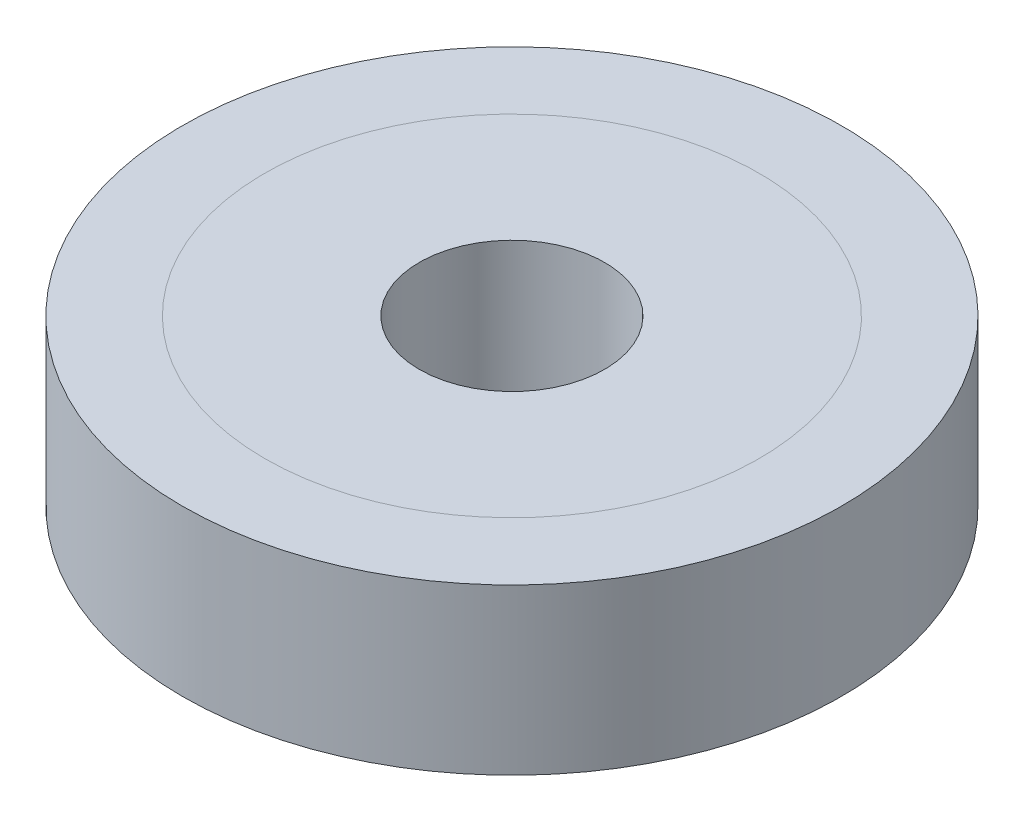
ISO-10303-21;
HEADER;
FILE_DESCRIPTION(('STEP AP214'),'2;1');
FILE_NAME('part.step','',(''),(''),'','','');
FILE_SCHEMA(('AUTOMOTIVE_DESIGN { 1 0 10303 214 1 1 1 1 }'));
ENDSEC;
DATA;
#1=APPLICATION_CONTEXT('core data for automotive mechanical design processes');
#2=APPLICATION_PROTOCOL_DEFINITION('international standard','automotive_design',2000,#1);
#3=PRODUCT_CONTEXT('',#1,'mechanical');
#4=PRODUCT('Part','Part','',(#3));
#5=PRODUCT_RELATED_PRODUCT_CATEGORY('part','',(#4));
#6=PRODUCT_DEFINITION_FORMATION('','',#4);
#7=PRODUCT_DEFINITION_CONTEXT('part definition',#1,'design');
#8=PRODUCT_DEFINITION('design','',#6,#7);
#9=PRODUCT_DEFINITION_SHAPE('','',#8);
#10=(LENGTH_UNIT() NAMED_UNIT(*) SI_UNIT(.MILLI.,.METRE.));
#11=(NAMED_UNIT(*) PLANE_ANGLE_UNIT() SI_UNIT($,.RADIAN.));
#12=(NAMED_UNIT(*) SI_UNIT($,.STERADIAN.) SOLID_ANGLE_UNIT());
#13=UNCERTAINTY_MEASURE_WITH_UNIT(LENGTH_MEASURE(1.E-05),#10,'distance_accuracy_value','');
#14=(GEOMETRIC_REPRESENTATION_CONTEXT(3) GLOBAL_UNCERTAINTY_ASSIGNED_CONTEXT((#13)) GLOBAL_UNIT_ASSIGNED_CONTEXT((#10,
#11,#12)) REPRESENTATION_CONTEXT('',''));
#15=CARTESIAN_POINT('',(0.,0.,0.));
#16=DIRECTION('',(0.,0.,1.));
#17=DIRECTION('',(1.,0.,0.));
#18=AXIS2_PLACEMENT_3D('',#15,#16,#17);
#19=CARTESIAN_POINT('',(0.,-45.254833995939,0.));
#20=DIRECTION('',(0.,1.,0.));
#21=DIRECTION('',(0.,0.,1.));
#22=AXIS2_PLACEMENT_3D('',#19,#20,#21);
#23=CYLINDRICAL_SURFACE('',#22,16.);
#24=CARTESIAN_POINT('',(0.,0.,0.));
#25=DIRECTION('',(0.,1.,0.));
#26=DIRECTION('',(0.,0.,1.));
#27=AXIS2_PLACEMENT_3D('',#24,#25,#26);
#28=CIRCLE('',#27,16.);
#29=CARTESIAN_POINT('',(0.,0.,16.));
#30=VERTEX_POINT('',#29);
#31=EDGE_CURVE('E11',#30,#30,#28,.F.);
#32=CARTESIAN_POINT('',(0.,8.,0.));
#33=DIRECTION('',(0.,1.,0.));
#34=DIRECTION('',(0.,0.,1.));
#35=AXIS2_PLACEMENT_3D('',#32,#33,#34);
#36=CIRCLE('',#35,16.);
#37=CARTESIAN_POINT('',(0.,7.99999999999999,16.));
#38=VERTEX_POINT('',#37);
#39=EDGE_CURVE('E58',#38,#38,#36,.T.);
#40=CARTESIAN_POINT('',(0.,0.,16.));
#41=CARTESIAN_POINT('',(0.,0.0833333333333333,16.));
#42=CARTESIAN_POINT('',(0.,0.166666666666667,16.));
#43=CARTESIAN_POINT('',(0.,0.333333333333334,16.));
#44=CARTESIAN_POINT('',(0.,0.416666666666667,16.));
#45=CARTESIAN_POINT('',(0.,0.583333333333334,16.));
#46=CARTESIAN_POINT('',(0.,0.666666666666667,16.));
#47=CARTESIAN_POINT('',(0.,0.833333333333334,16.));
#48=CARTESIAN_POINT('',(0.,0.916666666666668,16.));
#49=CARTESIAN_POINT('',(0.,1.08333333333333,16.));
#50=CARTESIAN_POINT('',(0.,1.16666666666667,16.));
#51=CARTESIAN_POINT('',(0.,1.33333333333333,16.));
#52=CARTESIAN_POINT('',(0.,1.41666666666667,16.));
#53=CARTESIAN_POINT('',(0.,1.58333333333333,16.));
#54=CARTESIAN_POINT('',(0.,1.66666666666667,16.));
#55=CARTESIAN_POINT('',(0.,1.83333333333334,16.));
#56=CARTESIAN_POINT('',(0.,1.91666666666667,16.));
#57=CARTESIAN_POINT('',(0.,2.08333333333333,16.));
#58=CARTESIAN_POINT('',(0.,2.16666666666666,16.));
#59=CARTESIAN_POINT('',(0.,2.33333333333333,16.));
#60=CARTESIAN_POINT('',(0.,2.41666666666666,16.));
#61=CARTESIAN_POINT('',(0.,2.58333333333333,16.));
#62=CARTESIAN_POINT('',(0.,2.66666666666666,16.));
#63=CARTESIAN_POINT('',(0.,2.83333333333333,16.));
#64=CARTESIAN_POINT('',(0.,2.91666666666666,16.));
#65=CARTESIAN_POINT('',(0.,3.08333333333333,16.));
#66=CARTESIAN_POINT('',(0.,3.16666666666666,16.));
#67=CARTESIAN_POINT('',(0.,3.33333333333333,16.));
#68=CARTESIAN_POINT('',(0.,3.41666666666666,16.));
#69=CARTESIAN_POINT('',(0.,3.58333333333333,16.));
#70=CARTESIAN_POINT('',(0.,3.66666666666666,16.));
#71=CARTESIAN_POINT('',(0.,3.83333333333333,16.));
#72=CARTESIAN_POINT('',(0.,3.91666666666666,16.));
#73=CARTESIAN_POINT('',(0.,4.08333333333333,16.));
#74=CARTESIAN_POINT('',(0.,4.16666666666666,16.));
#75=CARTESIAN_POINT('',(0.,4.33333333333333,16.));
#76=CARTESIAN_POINT('',(0.,4.41666666666666,16.));
#77=CARTESIAN_POINT('',(0.,4.58333333333333,16.));
#78=CARTESIAN_POINT('',(0.,4.66666666666666,16.));
#79=CARTESIAN_POINT('',(0.,4.83333333333333,16.));
#80=CARTESIAN_POINT('',(0.,4.91666666666666,16.));
#81=CARTESIAN_POINT('',(0.,5.08333333333333,16.));
#82=CARTESIAN_POINT('',(0.,5.16666666666666,16.));
#83=CARTESIAN_POINT('',(0.,5.33333333333333,16.));
#84=CARTESIAN_POINT('',(0.,5.41666666666666,16.));
#85=CARTESIAN_POINT('',(0.,5.58333333333333,16.));
#86=CARTESIAN_POINT('',(0.,5.66666666666666,16.));
#87=CARTESIAN_POINT('',(0.,5.83333333333333,16.));
#88=CARTESIAN_POINT('',(0.,5.91666666666666,16.));
#89=CARTESIAN_POINT('',(0.,6.08333333333333,16.));
#90=CARTESIAN_POINT('',(0.,6.16666666666666,16.));
#91=CARTESIAN_POINT('',(0.,6.33333333333333,16.));
#92=CARTESIAN_POINT('',(0.,6.41666666666666,16.));
#93=CARTESIAN_POINT('',(0.,6.58333333333333,16.));
#94=CARTESIAN_POINT('',(0.,6.66666666666666,16.));
#95=CARTESIAN_POINT('',(0.,6.83333333333333,16.));
#96=CARTESIAN_POINT('',(0.,6.91666666666666,16.));
#97=CARTESIAN_POINT('',(0.,7.08333333333333,16.));
#98=CARTESIAN_POINT('',(0.,7.16666666666666,16.));
#99=CARTESIAN_POINT('',(0.,7.33333333333333,16.));
#100=CARTESIAN_POINT('',(0.,7.41666666666666,16.));
#101=CARTESIAN_POINT('',(0.,7.58333333333333,16.));
#102=CARTESIAN_POINT('',(0.,7.66666666666666,16.));
#103=CARTESIAN_POINT('',(0.,7.83333333333333,16.));
#104=CARTESIAN_POINT('',(0.,7.91666666666666,16.));
#105=CARTESIAN_POINT('',(0.,7.99999999999999,16.));
#106=B_SPLINE_CURVE_WITH_KNOTS('',3,(#40,#41,#42,#43,#44,#45,#46,#47,#48,#49,#50,#51,#52,#53,
#54,#55,#56,#57,#58,#59,#60,#61,#62,#63,#64,#65,#66,#67,#68,#69,#70,#71,#72,#73,#74,#75,#76,#77,
#78,#79,#80,#81,#82,#83,#84,#85,#86,#87,#88,#89,#90,#91,#92,#93,#94,#95,#96,#97,#98,#99,#100,
#101,#102,#103,#104,#105),.UNSPECIFIED.,.F.,.F.,(4,2,2,2,2,2,2,2,2,2,2,2,2,2,2,2,2,2,2,2,2,2,2,
2,2,2,2,2,2,2,2,2,4),(0.,0.25,0.5,0.750000000000001,1.,1.25,1.5,1.75,2.,2.25,2.5,2.75,3.,3.25,
3.5,3.75,4.,4.25,4.5,4.75,5.,5.25,5.5,5.74999999999999,5.99999999999999,6.24999999999999,
6.49999999999999,6.74999999999999,6.99999999999999,7.24999999999999,7.49999999999999,
7.74999999999999,7.99999999999999),.UNSPECIFIED.);
#107=EDGE_CURVE('BSEAM47',#30,#38,#106,.T.);
#108=ORIENTED_EDGE('',*,*,#31,.F.);
#109=ORIENTED_EDGE('',*,*,#39,.F.);
#110=ORIENTED_EDGE('',*,*,#107,.T.);
#111=ORIENTED_EDGE('',*,*,#107,.F.);
#112=EDGE_LOOP('',(#108,#110,#109,#111));
#113=FACE_BOUND('',#112,.T.);
#114=ADVANCED_FACE('F47',(#113),#23,.T.);
#115=CARTESIAN_POINT('',(0.,8.,0.));
#116=DIRECTION('',(0.,1.,0.));
#117=DIRECTION('',(0.,0.,1.));
#118=AXIS2_PLACEMENT_3D('',#115,#116,#117);
#119=PLANE('',#118);
#120=CARTESIAN_POINT('',(0.,8.,0.));
#121=DIRECTION('',(0.,1.,0.));
#122=DIRECTION('',(0.,0.,1.));
#123=AXIS2_PLACEMENT_3D('',#120,#121,#122);
#124=CIRCLE('',#123,12.);
#125=CARTESIAN_POINT('',(0.,7.99999999999999,12.));
#126=VERTEX_POINT('',#125);
#127=EDGE_CURVE('E60',#126,#126,#124,.T.);
#128=ORIENTED_EDGE('',*,*,#127,.F.);
#129=EDGE_LOOP('',(#128));
#130=FACE_BOUND('',#129,.T.);
#131=ORIENTED_EDGE('',*,*,#39,.T.);
#132=EDGE_LOOP('',(#131));
#133=FACE_BOUND('',#132,.T.);
#134=ADVANCED_FACE('F65',(#130,#133),#119,.T.);
#135=CARTESIAN_POINT('',(0.,-45.254833995939,0.));
#136=DIRECTION('',(0.,1.,0.));
#137=DIRECTION('',(0.,0.,1.));
#138=AXIS2_PLACEMENT_3D('',#135,#136,#137);
#139=CYLINDRICAL_SURFACE('',#138,12.);
#140=CARTESIAN_POINT('',(0.,0.,0.));
#141=DIRECTION('',(0.,1.,0.));
#142=DIRECTION('',(0.,0.,1.));
#143=AXIS2_PLACEMENT_3D('',#140,#141,#142);
#144=CIRCLE('',#143,12.);
#145=CARTESIAN_POINT('',(0.,0.,12.));
#146=VERTEX_POINT('',#145);
#147=EDGE_CURVE('E50',#146,#146,#144,.F.);
#148=CARTESIAN_POINT('',(0.,0.,12.));
#149=CARTESIAN_POINT('',(0.,0.0833333333333333,12.));
#150=CARTESIAN_POINT('',(0.,0.166666666666667,12.));
#151=CARTESIAN_POINT('',(0.,0.333333333333334,12.));
#152=CARTESIAN_POINT('',(0.,0.416666666666667,12.));
#153=CARTESIAN_POINT('',(0.,0.583333333333334,12.));
#154=CARTESIAN_POINT('',(0.,0.666666666666667,12.));
#155=CARTESIAN_POINT('',(0.,0.833333333333334,12.));
#156=CARTESIAN_POINT('',(0.,0.916666666666668,12.));
#157=CARTESIAN_POINT('',(0.,1.08333333333333,12.));
#158=CARTESIAN_POINT('',(0.,1.16666666666667,12.));
#159=CARTESIAN_POINT('',(0.,1.33333333333333,12.));
#160=CARTESIAN_POINT('',(0.,1.41666666666667,12.));
#161=CARTESIAN_POINT('',(0.,1.58333333333333,12.));
#162=CARTESIAN_POINT('',(0.,1.66666666666667,12.));
#163=CARTESIAN_POINT('',(0.,1.83333333333334,12.));
#164=CARTESIAN_POINT('',(0.,1.91666666666667,12.));
#165=CARTESIAN_POINT('',(0.,2.08333333333333,12.));
#166=CARTESIAN_POINT('',(0.,2.16666666666666,12.));
#167=CARTESIAN_POINT('',(0.,2.33333333333333,12.));
#168=CARTESIAN_POINT('',(0.,2.41666666666666,12.));
#169=CARTESIAN_POINT('',(0.,2.58333333333333,12.));
#170=CARTESIAN_POINT('',(0.,2.66666666666666,12.));
#171=CARTESIAN_POINT('',(0.,2.83333333333333,12.));
#172=CARTESIAN_POINT('',(0.,2.91666666666666,12.));
#173=CARTESIAN_POINT('',(0.,3.08333333333333,12.));
#174=CARTESIAN_POINT('',(0.,3.16666666666666,12.));
#175=CARTESIAN_POINT('',(0.,3.33333333333333,12.));
#176=CARTESIAN_POINT('',(0.,3.41666666666666,12.));
#177=CARTESIAN_POINT('',(0.,3.58333333333333,12.));
#178=CARTESIAN_POINT('',(0.,3.66666666666666,12.));
#179=CARTESIAN_POINT('',(0.,3.83333333333333,12.));
#180=CARTESIAN_POINT('',(0.,3.91666666666666,12.));
#181=CARTESIAN_POINT('',(0.,4.08333333333333,12.));
#182=CARTESIAN_POINT('',(0.,4.16666666666666,12.));
#183=CARTESIAN_POINT('',(0.,4.33333333333333,12.));
#184=CARTESIAN_POINT('',(0.,4.41666666666666,12.));
#185=CARTESIAN_POINT('',(0.,4.58333333333333,12.));
#186=CARTESIAN_POINT('',(0.,4.66666666666666,12.));
#187=CARTESIAN_POINT('',(0.,4.83333333333333,12.));
#188=CARTESIAN_POINT('',(0.,4.91666666666666,12.));
#189=CARTESIAN_POINT('',(0.,5.08333333333333,12.));
#190=CARTESIAN_POINT('',(0.,5.16666666666666,12.));
#191=CARTESIAN_POINT('',(0.,5.33333333333333,12.));
#192=CARTESIAN_POINT('',(0.,5.41666666666666,12.));
#193=CARTESIAN_POINT('',(0.,5.58333333333333,12.));
#194=CARTESIAN_POINT('',(0.,5.66666666666666,12.));
#195=CARTESIAN_POINT('',(0.,5.83333333333333,12.));
#196=CARTESIAN_POINT('',(0.,5.91666666666666,12.));
#197=CARTESIAN_POINT('',(0.,6.08333333333333,12.));
#198=CARTESIAN_POINT('',(0.,6.16666666666666,12.));
#199=CARTESIAN_POINT('',(0.,6.33333333333333,12.));
#200=CARTESIAN_POINT('',(0.,6.41666666666666,12.));
#201=CARTESIAN_POINT('',(0.,6.58333333333333,12.));
#202=CARTESIAN_POINT('',(0.,6.66666666666666,12.));
#203=CARTESIAN_POINT('',(0.,6.83333333333333,12.));
#204=CARTESIAN_POINT('',(0.,6.91666666666666,12.));
#205=CARTESIAN_POINT('',(0.,7.08333333333333,12.));
#206=CARTESIAN_POINT('',(0.,7.16666666666666,12.));
#207=CARTESIAN_POINT('',(0.,7.33333333333333,12.));
#208=CARTESIAN_POINT('',(0.,7.41666666666666,12.));
#209=CARTESIAN_POINT('',(0.,7.58333333333333,12.));
#210=CARTESIAN_POINT('',(0.,7.66666666666666,12.));
#211=CARTESIAN_POINT('',(0.,7.83333333333333,12.));
#212=CARTESIAN_POINT('',(0.,7.91666666666666,12.));
#213=CARTESIAN_POINT('',(0.,7.99999999999999,12.));
#214=B_SPLINE_CURVE_WITH_KNOTS('',3,(#148,#149,#150,#151,#152,#153,#154,#155,#156,#157,#158,
#159,#160,#161,#162,#163,#164,#165,#166,#167,#168,#169,#170,#171,#172,#173,#174,#175,#176,#177,
#178,#179,#180,#181,#182,#183,#184,#185,#186,#187,#188,#189,#190,#191,#192,#193,#194,#195,#196,
#197,#198,#199,#200,#201,#202,#203,#204,#205,#206,#207,#208,#209,#210,#211,#212,#213),
.UNSPECIFIED.,.F.,.F.,(4,2,2,2,2,2,2,2,2,2,2,2,2,2,2,2,2,2,2,2,2,2,2,2,2,2,2,2,2,2,2,2,4),(0.,
0.25,0.5,0.750000000000001,1.,1.25,1.5,1.75,2.,2.25,2.5,2.75,3.,3.25,3.5,3.75,4.,4.25,4.5,4.75,
5.,5.25,5.5,5.74999999999999,5.99999999999999,6.24999999999999,6.49999999999999,
6.74999999999999,6.99999999999999,7.24999999999999,7.49999999999999,7.74999999999999,
7.99999999999999),.UNSPECIFIED.);
#215=EDGE_CURVE('BSEAM72',#146,#126,#214,.T.);
#216=ORIENTED_EDGE('',*,*,#147,.T.);
#217=ORIENTED_EDGE('',*,*,#127,.T.);
#218=ORIENTED_EDGE('',*,*,#215,.T.);
#219=ORIENTED_EDGE('',*,*,#215,.F.);
#220=EDGE_LOOP('',(#216,#218,#217,#219));
#221=FACE_BOUND('',#220,.T.);
#222=ADVANCED_FACE('F72',(#221),#139,.F.);
#223=CARTESIAN_POINT('',(0.,0.,0.));
#224=DIRECTION('',(0.,1.,0.));
#225=DIRECTION('',(0.,0.,1.));
#226=AXIS2_PLACEMENT_3D('',#223,#224,#225);
#227=PLANE('',#226);
#228=ORIENTED_EDGE('',*,*,#31,.T.);
#229=EDGE_LOOP('',(#228));
#230=FACE_BOUND('',#229,.T.);
#231=ORIENTED_EDGE('',*,*,#147,.F.);
#232=EDGE_LOOP('',(#231));
#233=FACE_BOUND('',#232,.T.);
#234=ADVANCED_FACE('F77',(#230,#233),#227,.F.);
#235=CLOSED_SHELL('',(#114,#134,#222,#234));
#236=MANIFOLD_SOLID_BREP('B2',#235);
#237=CARTESIAN_POINT('',(0.,8.,0.));
#238=DIRECTION('',(0.,1.,0.));
#239=DIRECTION('',(0.,0.,1.));
#240=AXIS2_PLACEMENT_3D('',#237,#238,#239);
#241=PLANE('',#240);
#242=CARTESIAN_POINT('',(0.,8.,0.));
#243=DIRECTION('',(0.,1.,0.));
#244=DIRECTION('',(0.,0.,1.));
#245=AXIS2_PLACEMENT_3D('',#242,#243,#244);
#246=CIRCLE('',#245,12.);
#247=CARTESIAN_POINT('',(0.,8.,12.));
#248=VERTEX_POINT('',#247);
#249=EDGE_CURVE('E46',#248,#248,#246,.T.);
#250=ORIENTED_EDGE('',*,*,#249,.T.);
#251=EDGE_LOOP('',(#250));
#252=FACE_BOUND('',#251,.T.);
#253=CARTESIAN_POINT('',(0.,8.,0.));
#254=DIRECTION('',(0.,1.,0.));
#255=DIRECTION('',(0.,0.,1.));
#256=AXIS2_PLACEMENT_3D('',#253,#254,#255);
#257=CIRCLE('',#256,4.5);
#258=CARTESIAN_POINT('',(0.,8.,4.5));
#259=VERTEX_POINT('',#258);
#260=EDGE_CURVE('E128',#259,#259,#257,.T.);
#261=ORIENTED_EDGE('',*,*,#260,.F.);
#262=EDGE_LOOP('',(#261));
#263=FACE_BOUND('',#262,.T.);
#264=ADVANCED_FACE('F117',(#252,#263),#241,.T.);
#265=CARTESIAN_POINT('',(0.,0.,0.));
#266=DIRECTION('',(0.,1.,0.));
#267=DIRECTION('',(0.,0.,1.));
#268=AXIS2_PLACEMENT_3D('',#265,#266,#267);
#269=PLANE('',#268);
#270=CARTESIAN_POINT('',(0.,0.,0.));
#271=DIRECTION('',(0.,1.,0.));
#272=DIRECTION('',(0.,0.,1.));
#273=AXIS2_PLACEMENT_3D('',#270,#271,#272);
#274=CIRCLE('',#273,12.);
#275=CARTESIAN_POINT('',(0.,0.,12.));
#276=VERTEX_POINT('',#275);
#277=EDGE_CURVE('E121',#276,#276,#274,.T.);
#278=ORIENTED_EDGE('',*,*,#277,.F.);
#279=EDGE_LOOP('',(#278));
#280=FACE_BOUND('',#279,.T.);
#281=CARTESIAN_POINT('',(0.,0.,0.));
#282=DIRECTION('',(0.,1.,0.));
#283=DIRECTION('',(0.,0.,1.));
#284=AXIS2_PLACEMENT_3D('',#281,#282,#283);
#285=CIRCLE('',#284,4.5);
#286=CARTESIAN_POINT('',(0.,0.,4.5));
#287=VERTEX_POINT('',#286);
#288=EDGE_CURVE('E130',#287,#287,#285,.T.);
#289=ORIENTED_EDGE('',*,*,#288,.T.);
#290=EDGE_LOOP('',(#289));
#291=FACE_BOUND('',#290,.T.);
#292=ADVANCED_FACE('F140',(#280,#291),#269,.F.);
#293=CARTESIAN_POINT('',(0.,8.,0.));
#294=DIRECTION('',(0.,-1.,0.));
#295=DIRECTION('',(0.,0.,-1.));
#296=AXIS2_PLACEMENT_3D('',#293,#294,#295);
#297=CYLINDRICAL_SURFACE('',#296,12.);
#298=ORIENTED_EDGE('',*,*,#249,.F.);
#299=EDGE_LOOP('',(#298));
#300=FACE_BOUND('',#299,.T.);
#301=ORIENTED_EDGE('',*,*,#277,.T.);
#302=EDGE_LOOP('',(#301));
#303=FACE_BOUND('',#302,.T.);
#304=ADVANCED_FACE('F119',(#300,#303),#297,.T.);
#305=CARTESIAN_POINT('',(0.,8.,0.));
#306=DIRECTION('',(0.,-1.,0.));
#307=DIRECTION('',(0.,0.,-1.));
#308=AXIS2_PLACEMENT_3D('',#305,#306,#307);
#309=CYLINDRICAL_SURFACE('',#308,4.5);
#310=ORIENTED_EDGE('',*,*,#260,.T.);
#311=EDGE_LOOP('',(#310));
#312=FACE_BOUND('',#311,.T.);
#313=ORIENTED_EDGE('',*,*,#288,.F.);
#314=EDGE_LOOP('',(#313));
#315=FACE_BOUND('',#314,.T.);
#316=ADVANCED_FACE('F136',(#312,#315),#309,.F.);
#317=CLOSED_SHELL('',(#264,#292,#304,#316));
#318=MANIFOLD_SOLID_BREP('B6',#317);
#319=ADVANCED_BREP_SHAPE_REPRESENTATION('',(#18,#236,#318),#14);
#320=SHAPE_DEFINITION_REPRESENTATION(#9,#319);
ENDSEC;
END-ISO-10303-21;
